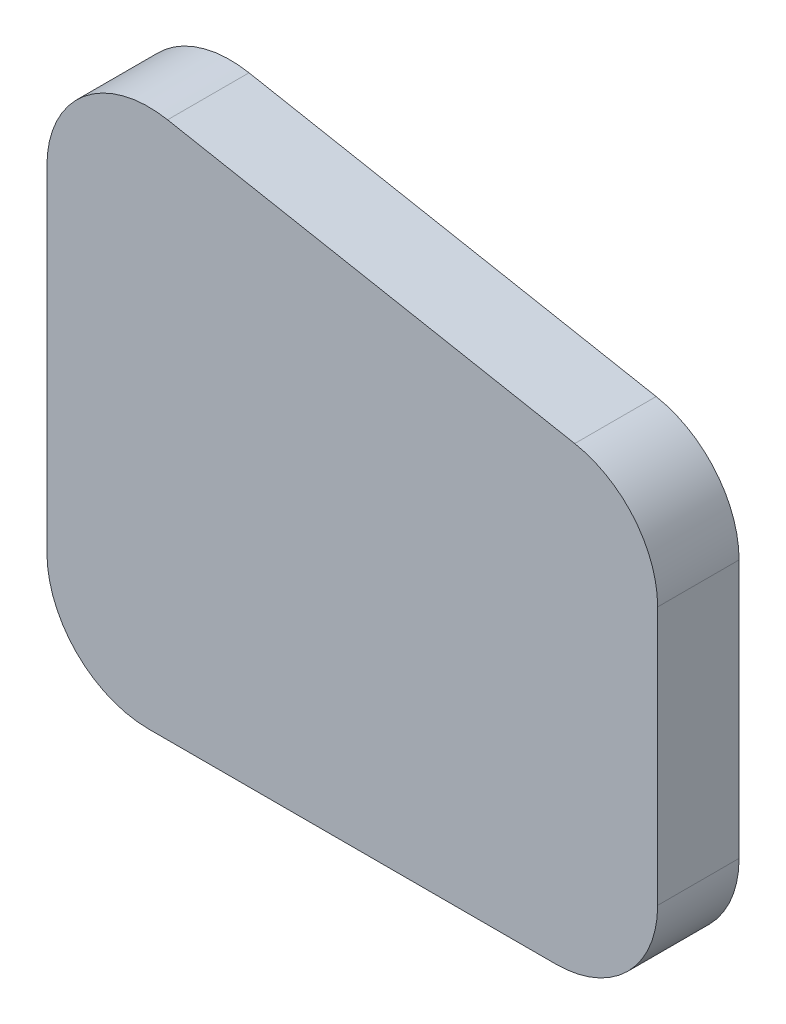
ISO-10303-21;
HEADER;
FILE_DESCRIPTION(('STEP AP214'),'2;1');
FILE_NAME('part.step','',(''),(''),'','','');
FILE_SCHEMA(('AUTOMOTIVE_DESIGN { 1 0 10303 214 1 1 1 1 }'));
ENDSEC;
DATA;
#1=APPLICATION_CONTEXT('core data for automotive mechanical design processes');
#2=APPLICATION_PROTOCOL_DEFINITION('international standard','automotive_design',2000,#1);
#3=PRODUCT_CONTEXT('',#1,'mechanical');
#4=PRODUCT('Part','Part','',(#3));
#5=PRODUCT_RELATED_PRODUCT_CATEGORY('part','',(#4));
#6=PRODUCT_DEFINITION_FORMATION('','',#4);
#7=PRODUCT_DEFINITION_CONTEXT('part definition',#1,'design');
#8=PRODUCT_DEFINITION('design','',#6,#7);
#9=PRODUCT_DEFINITION_SHAPE('','',#8);
#10=(LENGTH_UNIT() NAMED_UNIT(*) SI_UNIT(.MILLI.,.METRE.));
#11=(NAMED_UNIT(*) PLANE_ANGLE_UNIT() SI_UNIT($,.RADIAN.));
#12=(NAMED_UNIT(*) SI_UNIT($,.STERADIAN.) SOLID_ANGLE_UNIT());
#13=UNCERTAINTY_MEASURE_WITH_UNIT(LENGTH_MEASURE(1.E-05),#10,'distance_accuracy_value','');
#14=(GEOMETRIC_REPRESENTATION_CONTEXT(3) GLOBAL_UNCERTAINTY_ASSIGNED_CONTEXT((#13)) GLOBAL_UNIT_ASSIGNED_CONTEXT((#10,
#11,#12)) REPRESENTATION_CONTEXT('',''));
#15=CARTESIAN_POINT('',(0.,0.,0.));
#16=DIRECTION('',(0.,0.,1.));
#17=DIRECTION('',(1.,0.,0.));
#18=AXIS2_PLACEMENT_3D('',#15,#16,#17);
#19=CARTESIAN_POINT('',(50.7305826054909,-24.9281709664276,2.54));
#20=DIRECTION('',(0.,0.,-1.));
#21=DIRECTION('',(-1.,0.,0.));
#22=AXIS2_PLACEMENT_3D('',#19,#20,#21);
#23=CYLINDRICAL_SURFACE('',#22,3.175);
#24=CARTESIAN_POINT('',(50.7305826054909,-24.9281709664276,0.));
#25=DIRECTION('',(0.,0.,1.));
#26=DIRECTION('',(1.,0.,0.));
#27=AXIS2_PLACEMENT_3D('',#24,#25,#26);
#28=CIRCLE('',#27,3.175);
#29=CARTESIAN_POINT('',(47.5555826054909,-24.9281709664276,0.));
#30=VERTEX_POINT('',#29);
#31=CARTESIAN_POINT('',(50.7305826054909,-28.1031709664276,0.));
#32=VERTEX_POINT('',#31);
#33=EDGE_CURVE('E129',#30,#32,#28,.T.);
#34=ORIENTED_EDGE('',*,*,#33,.T.);
#35=DIRECTION('',(0.,0.,-1.));
#36=VECTOR('',#35,1.);
#37=CARTESIAN_POINT('',(50.7305826054909,-28.1031709664276,2.54));
#38=LINE('',#37,#36);
#39=CARTESIAN_POINT('',(50.7305826054909,-28.1031709664276,2.54));
#40=VERTEX_POINT('',#39);
#41=EDGE_CURVE('E11',#40,#32,#38,.T.);
#42=ORIENTED_EDGE('',*,*,#41,.F.);
#43=CARTESIAN_POINT('',(50.7305826054909,-24.9281709664276,2.54));
#44=DIRECTION('',(0.,0.,1.));
#45=DIRECTION('',(1.,0.,0.));
#46=AXIS2_PLACEMENT_3D('',#43,#44,#45);
#47=CIRCLE('',#46,3.175);
#48=CARTESIAN_POINT('',(47.5555826054909,-24.9281709664276,2.54));
#49=VERTEX_POINT('',#48);
#50=EDGE_CURVE('E143',#49,#40,#47,.T.);
#51=ORIENTED_EDGE('',*,*,#50,.F.);
#52=DIRECTION('',(0.,0.,-1.));
#53=VECTOR('',#52,1.);
#54=CARTESIAN_POINT('',(47.5555826054909,-24.9281709664276,2.54));
#55=LINE('',#54,#53);
#56=EDGE_CURVE('E125',#49,#30,#55,.T.);
#57=ORIENTED_EDGE('',*,*,#56,.T.);
#58=EDGE_LOOP('',(#34,#42,#51,#57));
#59=FACE_BOUND('',#58,.T.);
#60=ADVANCED_FACE('F33',(#59),#23,.T.);
#61=CARTESIAN_POINT('',(50.7305826054909,-28.1031709664276,2.54));
#62=DIRECTION('',(0.,1.,0.));
#63=DIRECTION('',(-1.,0.,0.));
#64=AXIS2_PLACEMENT_3D('',#61,#62,#63);
#65=PLANE('',#64);
#66=DIRECTION('',(1.,0.,0.));
#67=VECTOR('',#66,1.);
#68=CARTESIAN_POINT('',(50.7305826054909,-28.1031709664276,0.));
#69=LINE('',#68,#67);
#70=CARTESIAN_POINT('',(63.430582605491,-28.1031709664276,0.));
#71=VERTEX_POINT('',#70);
#72=EDGE_CURVE('E132',#32,#71,#69,.T.);
#73=ORIENTED_EDGE('',*,*,#72,.T.);
#74=DIRECTION('',(0.,0.,-1.));
#75=VECTOR('',#74,1.);
#76=CARTESIAN_POINT('',(63.430582605491,-28.1031709664276,2.54));
#77=LINE('',#76,#75);
#78=CARTESIAN_POINT('',(63.430582605491,-28.1031709664276,2.54));
#79=VERTEX_POINT('',#78);
#80=EDGE_CURVE('E41',#79,#71,#77,.T.);
#81=ORIENTED_EDGE('',*,*,#80,.F.);
#82=DIRECTION('',(1.,0.,0.));
#83=VECTOR('',#82,1.);
#84=CARTESIAN_POINT('',(50.7305826054909,-28.1031709664276,2.54));
#85=LINE('',#84,#83);
#86=EDGE_CURVE('E92',#40,#79,#85,.T.);
#87=ORIENTED_EDGE('',*,*,#86,.F.);
#88=ORIENTED_EDGE('',*,*,#41,.T.);
#89=EDGE_LOOP('',(#73,#81,#87,#88));
#90=FACE_BOUND('',#89,.T.);
#91=ADVANCED_FACE('F178',(#90),#65,.F.);
#92=CARTESIAN_POINT('',(63.430582605491,-24.9281709664276,2.54));
#93=DIRECTION('',(0.,0.,-1.));
#94=DIRECTION('',(-1.,0.,0.));
#95=AXIS2_PLACEMENT_3D('',#92,#93,#94);
#96=CYLINDRICAL_SURFACE('',#95,3.175);
#97=CARTESIAN_POINT('',(63.430582605491,-24.9281709664276,0.));
#98=DIRECTION('',(0.,0.,1.));
#99=DIRECTION('',(1.,0.,0.));
#100=AXIS2_PLACEMENT_3D('',#97,#98,#99);
#101=CIRCLE('',#100,3.175);
#102=CARTESIAN_POINT('',(66.605582605491,-24.9281709664276,0.));
#103=VERTEX_POINT('',#102);
#104=EDGE_CURVE('E134',#71,#103,#101,.T.);
#105=ORIENTED_EDGE('',*,*,#104,.T.);
#106=DIRECTION('',(0.,0.,-1.));
#107=VECTOR('',#106,1.);
#108=CARTESIAN_POINT('',(66.605582605491,-24.9281709664276,2.54));
#109=LINE('',#108,#107);
#110=CARTESIAN_POINT('',(66.605582605491,-24.9281709664276,2.54));
#111=VERTEX_POINT('',#110);
#112=EDGE_CURVE('E150',#111,#103,#109,.T.);
#113=ORIENTED_EDGE('',*,*,#112,.F.);
#114=CARTESIAN_POINT('',(63.430582605491,-24.9281709664276,2.54));
#115=DIRECTION('',(0.,0.,1.));
#116=DIRECTION('',(1.,0.,0.));
#117=AXIS2_PLACEMENT_3D('',#114,#115,#116);
#118=CIRCLE('',#117,3.175);
#119=EDGE_CURVE('E158',#79,#111,#118,.T.);
#120=ORIENTED_EDGE('',*,*,#119,.F.);
#121=ORIENTED_EDGE('',*,*,#80,.T.);
#122=EDGE_LOOP('',(#105,#113,#120,#121));
#123=FACE_BOUND('',#122,.T.);
#124=ADVANCED_FACE('F156',(#123),#96,.T.);
#125=CARTESIAN_POINT('',(66.605582605491,-24.9281709664276,2.54));
#126=DIRECTION('',(-1.,0.,0.));
#127=DIRECTION('',(0.,0.,1.));
#128=AXIS2_PLACEMENT_3D('',#125,#126,#127);
#129=PLANE('',#128);
#130=DIRECTION('',(0.,1.,0.));
#131=VECTOR('',#130,1.);
#132=CARTESIAN_POINT('',(66.605582605491,-24.9281709664276,0.));
#133=LINE('',#132,#131);
#134=CARTESIAN_POINT('',(66.605582605491,-16.8657970719251,0.));
#135=VERTEX_POINT('',#134);
#136=EDGE_CURVE('E136',#103,#135,#133,.T.);
#137=ORIENTED_EDGE('',*,*,#136,.T.);
#138=DIRECTION('',(0.,0.,-1.));
#139=VECTOR('',#138,1.);
#140=CARTESIAN_POINT('',(66.605582605491,-16.8657970719251,2.54));
#141=LINE('',#140,#139);
#142=CARTESIAN_POINT('',(66.605582605491,-16.8657970719251,2.54));
#143=VERTEX_POINT('',#142);
#144=EDGE_CURVE('E147',#143,#135,#141,.T.);
#145=ORIENTED_EDGE('',*,*,#144,.F.);
#146=DIRECTION('',(0.,1.,0.));
#147=VECTOR('',#146,1.);
#148=CARTESIAN_POINT('',(66.605582605491,-24.9281709664276,2.54));
#149=LINE('',#148,#147);
#150=EDGE_CURVE('E170',#111,#143,#149,.T.);
#151=ORIENTED_EDGE('',*,*,#150,.F.);
#152=ORIENTED_EDGE('',*,*,#112,.T.);
#153=EDGE_LOOP('',(#137,#145,#151,#152));
#154=FACE_BOUND('',#153,.T.);
#155=ADVANCED_FACE('F166',(#154),#129,.F.);
#156=CARTESIAN_POINT('',(63.430582605491,-16.8657970719251,2.54));
#157=DIRECTION('',(0.,0.,-1.));
#158=DIRECTION('',(-1.,0.,0.));
#159=AXIS2_PLACEMENT_3D('',#156,#157,#158);
#160=CYLINDRICAL_SURFACE('',#159,3.175);
#161=CARTESIAN_POINT('',(63.430582605491,-16.8657970719251,0.));
#162=DIRECTION('',(0.,0.,1.));
#163=DIRECTION('',(1.,0.,0.));
#164=AXIS2_PLACEMENT_3D('',#161,#162,#163);
#165=CIRCLE('',#164,3.175);
#166=CARTESIAN_POINT('',(64.0190370873672,-13.7458056740587,0.));
#167=VERTEX_POINT('',#166);
#168=EDGE_CURVE('E138',#135,#167,#165,.T.);
#169=ORIENTED_EDGE('',*,*,#168,.T.);
#170=DIRECTION('',(0.,0.,-1.));
#171=VECTOR('',#170,1.);
#172=CARTESIAN_POINT('',(64.0190370873672,-13.7458056740587,2.54));
#173=LINE('',#172,#171);
#174=CARTESIAN_POINT('',(64.0190370873672,-13.7458056740587,2.54));
#175=VERTEX_POINT('',#174);
#176=EDGE_CURVE('E120',#175,#167,#173,.T.);
#177=ORIENTED_EDGE('',*,*,#176,.F.);
#178=CARTESIAN_POINT('',(63.430582605491,-16.8657970719251,2.54));
#179=DIRECTION('',(0.,0.,1.));
#180=DIRECTION('',(1.,0.,0.));
#181=AXIS2_PLACEMENT_3D('',#178,#179,#180);
#182=CIRCLE('',#181,3.175);
#183=EDGE_CURVE('E111',#143,#175,#182,.T.);
#184=ORIENTED_EDGE('',*,*,#183,.F.);
#185=ORIENTED_EDGE('',*,*,#144,.T.);
#186=EDGE_LOOP('',(#169,#177,#184,#185));
#187=FACE_BOUND('',#186,.T.);
#188=ADVANCED_FACE('F169',(#187),#160,.T.);
#189=CARTESIAN_POINT('',(64.0190370873672,-13.7458056740587,2.54));
#190=DIRECTION('',(-0.185339994291723,-0.982674456020886,0.));
#191=DIRECTION('',(0.982674456020886,-0.185339994291723,0.));
#192=AXIS2_PLACEMENT_3D('',#189,#190,#191);
#193=PLANE('',#192);
#194=DIRECTION('',(-0.982674456020886,0.185339994291723,0.));
#195=VECTOR('',#194,1.);
#196=CARTESIAN_POINT('',(64.0190370873672,-13.7458056740587,0.));
#197=LINE('',#196,#195);
#198=CARTESIAN_POINT('',(51.3190370873672,-11.3504875571758,0.));
#199=VERTEX_POINT('',#198);
#200=EDGE_CURVE('E119',#167,#199,#197,.T.);
#201=ORIENTED_EDGE('',*,*,#200,.T.);
#202=DIRECTION('',(0.,0.,-1.));
#203=VECTOR('',#202,1.);
#204=CARTESIAN_POINT('',(51.3190370873672,-11.3504875571758,2.54));
#205=LINE('',#204,#203);
#206=CARTESIAN_POINT('',(51.3190370873672,-11.3504875571758,2.54));
#207=VERTEX_POINT('',#206);
#208=EDGE_CURVE('E116',#207,#199,#205,.T.);
#209=ORIENTED_EDGE('',*,*,#208,.F.);
#210=DIRECTION('',(-0.982674456020886,0.185339994291723,0.));
#211=VECTOR('',#210,1.);
#212=CARTESIAN_POINT('',(64.0190370873672,-13.7458056740587,2.54));
#213=LINE('',#212,#211);
#214=EDGE_CURVE('E105',#175,#207,#213,.T.);
#215=ORIENTED_EDGE('',*,*,#214,.F.);
#216=ORIENTED_EDGE('',*,*,#176,.T.);
#217=EDGE_LOOP('',(#201,#209,#215,#216));
#218=FACE_BOUND('',#217,.T.);
#219=ADVANCED_FACE('F117',(#218),#193,.F.);
#220=CARTESIAN_POINT('',(50.730582605491,-14.4704789550422,2.54));
#221=DIRECTION('',(0.,0.,-1.));
#222=DIRECTION('',(-1.,0.,0.));
#223=AXIS2_PLACEMENT_3D('',#220,#221,#222);
#224=CYLINDRICAL_SURFACE('',#223,3.175);
#225=CARTESIAN_POINT('',(50.730582605491,-14.4704789550422,0.));
#226=DIRECTION('',(0.,0.,1.));
#227=DIRECTION('',(1.,0.,0.));
#228=AXIS2_PLACEMENT_3D('',#225,#226,#227);
#229=CIRCLE('',#228,3.175);
#230=CARTESIAN_POINT('',(47.555582605491,-14.4704789550422,0.));
#231=VERTEX_POINT('',#230);
#232=EDGE_CURVE('E78',#199,#231,#229,.T.);
#233=ORIENTED_EDGE('',*,*,#232,.T.);
#234=DIRECTION('',(0.,0.,-1.));
#235=VECTOR('',#234,1.);
#236=CARTESIAN_POINT('',(47.555582605491,-14.4704789550422,2.54));
#237=LINE('',#236,#235);
#238=CARTESIAN_POINT('',(47.555582605491,-14.4704789550422,2.54));
#239=VERTEX_POINT('',#238);
#240=EDGE_CURVE('E121',#239,#231,#237,.T.);
#241=ORIENTED_EDGE('',*,*,#240,.F.);
#242=CARTESIAN_POINT('',(50.730582605491,-14.4704789550422,2.54));
#243=DIRECTION('',(0.,0.,1.));
#244=DIRECTION('',(1.,0.,0.));
#245=AXIS2_PLACEMENT_3D('',#242,#243,#244);
#246=CIRCLE('',#245,3.175);
#247=EDGE_CURVE('E109',#207,#239,#246,.T.);
#248=ORIENTED_EDGE('',*,*,#247,.F.);
#249=ORIENTED_EDGE('',*,*,#208,.T.);
#250=EDGE_LOOP('',(#233,#241,#248,#249));
#251=FACE_BOUND('',#250,.T.);
#252=ADVANCED_FACE('F123',(#251),#224,.T.);
#253=CARTESIAN_POINT('',(47.555582605491,-14.4704789550422,2.54));
#254=DIRECTION('',(1.,0.,0.));
#255=DIRECTION('',(0.,1.,0.));
#256=AXIS2_PLACEMENT_3D('',#253,#254,#255);
#257=PLANE('',#256);
#258=DIRECTION('',(0.,-1.,0.));
#259=VECTOR('',#258,1.);
#260=CARTESIAN_POINT('',(47.555582605491,-14.4704789550422,0.));
#261=LINE('',#260,#259);
#262=EDGE_CURVE('E84',#231,#30,#261,.T.);
#263=ORIENTED_EDGE('',*,*,#262,.T.);
#264=ORIENTED_EDGE('',*,*,#56,.F.);
#265=DIRECTION('',(0.,-1.,0.));
#266=VECTOR('',#265,1.);
#267=CARTESIAN_POINT('',(47.555582605491,-14.4704789550422,2.54));
#268=LINE('',#267,#266);
#269=EDGE_CURVE('E49',#239,#49,#268,.T.);
#270=ORIENTED_EDGE('',*,*,#269,.F.);
#271=ORIENTED_EDGE('',*,*,#240,.T.);
#272=EDGE_LOOP('',(#263,#264,#270,#271));
#273=FACE_BOUND('',#272,.T.);
#274=ADVANCED_FACE('F194',(#273),#257,.F.);
#275=CARTESIAN_POINT('',(50.7305826054909,-24.9281709664276,2.54));
#276=DIRECTION('',(0.,0.,1.));
#277=DIRECTION('',(1.,0.,0.));
#278=AXIS2_PLACEMENT_3D('',#275,#276,#277);
#279=PLANE('',#278);
#280=ORIENTED_EDGE('',*,*,#50,.T.);
#281=ORIENTED_EDGE('',*,*,#86,.T.);
#282=ORIENTED_EDGE('',*,*,#119,.T.);
#283=ORIENTED_EDGE('',*,*,#150,.T.);
#284=ORIENTED_EDGE('',*,*,#183,.T.);
#285=ORIENTED_EDGE('',*,*,#214,.T.);
#286=ORIENTED_EDGE('',*,*,#247,.T.);
#287=ORIENTED_EDGE('',*,*,#269,.T.);
#288=EDGE_LOOP('',(#280,#281,#282,#283,#284,#285,#286,#287));
#289=FACE_BOUND('',#288,.T.);
#290=ADVANCED_FACE('F107',(#289),#279,.T.);
#291=CARTESIAN_POINT('',(50.7305826054909,-24.9281709664276,0.));
#292=DIRECTION('',(0.,0.,1.));
#293=DIRECTION('',(1.,0.,0.));
#294=AXIS2_PLACEMENT_3D('',#291,#292,#293);
#295=PLANE('',#294);
#296=ORIENTED_EDGE('',*,*,#33,.F.);
#297=ORIENTED_EDGE('',*,*,#262,.F.);
#298=ORIENTED_EDGE('',*,*,#232,.F.);
#299=ORIENTED_EDGE('',*,*,#200,.F.);
#300=ORIENTED_EDGE('',*,*,#168,.F.);
#301=ORIENTED_EDGE('',*,*,#136,.F.);
#302=ORIENTED_EDGE('',*,*,#104,.F.);
#303=ORIENTED_EDGE('',*,*,#72,.F.);
#304=EDGE_LOOP('',(#296,#297,#298,#299,#300,#301,#302,#303));
#305=FACE_BOUND('',#304,.T.);
#306=ADVANCED_FACE('F162',(#305),#295,.F.);
#307=CLOSED_SHELL('',(#60,#91,#124,#155,#188,#219,#252,#274,#290,#306));
#308=MANIFOLD_SOLID_BREP('B2',#307);
#309=ADVANCED_BREP_SHAPE_REPRESENTATION('',(#18,#308),#14);
#310=SHAPE_DEFINITION_REPRESENTATION(#9,#309);
ENDSEC;
END-ISO-10303-21;
